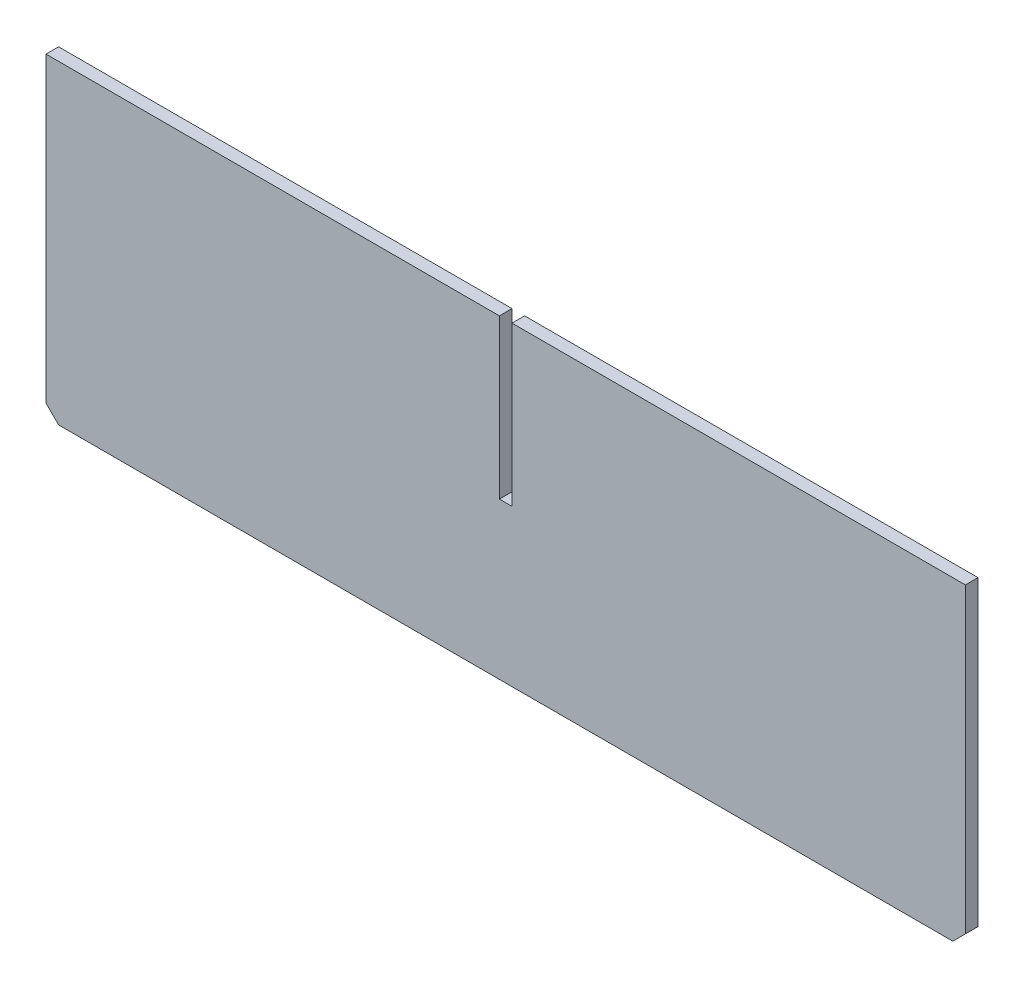
ISO-10303-21;
HEADER;
FILE_DESCRIPTION(('STEP AP214'),'2;1');
FILE_NAME('part.step','',(''),(''),'','','');
FILE_SCHEMA(('AUTOMOTIVE_DESIGN { 1 0 10303 214 1 1 1 1 }'));
ENDSEC;
DATA;
#1=APPLICATION_CONTEXT('core data for automotive mechanical design processes');
#2=APPLICATION_PROTOCOL_DEFINITION('international standard','automotive_design',2000,#1);
#3=PRODUCT_CONTEXT('',#1,'mechanical');
#4=PRODUCT('Part','Part','',(#3));
#5=PRODUCT_RELATED_PRODUCT_CATEGORY('part','',(#4));
#6=PRODUCT_DEFINITION_FORMATION('','',#4);
#7=PRODUCT_DEFINITION_CONTEXT('part definition',#1,'design');
#8=PRODUCT_DEFINITION('design','',#6,#7);
#9=PRODUCT_DEFINITION_SHAPE('','',#8);
#10=(LENGTH_UNIT() NAMED_UNIT(*) SI_UNIT(.MILLI.,.METRE.));
#11=(NAMED_UNIT(*) PLANE_ANGLE_UNIT() SI_UNIT($,.RADIAN.));
#12=(NAMED_UNIT(*) SI_UNIT($,.STERADIAN.) SOLID_ANGLE_UNIT());
#13=UNCERTAINTY_MEASURE_WITH_UNIT(LENGTH_MEASURE(1.E-05),#10,'distance_accuracy_value','');
#14=(GEOMETRIC_REPRESENTATION_CONTEXT(3) GLOBAL_UNCERTAINTY_ASSIGNED_CONTEXT((#13)) GLOBAL_UNIT_ASSIGNED_CONTEXT((#10,
#11,#12)) REPRESENTATION_CONTEXT('',''));
#15=CARTESIAN_POINT('',(0.,0.,0.));
#16=DIRECTION('',(0.,0.,1.));
#17=DIRECTION('',(1.,0.,0.));
#18=AXIS2_PLACEMENT_3D('',#15,#16,#17);
#19=CARTESIAN_POINT('',(0.,0.,2.));
#20=DIRECTION('',(0.,-1.,0.));
#21=DIRECTION('',(0.,0.,-1.));
#22=AXIS2_PLACEMENT_3D('',#19,#20,#21);
#23=PLANE('',#22);
#24=DIRECTION('',(-1.,0.,0.));
#25=VECTOR('',#24,1.);
#26=CARTESIAN_POINT('',(0.,0.,2.));
#27=LINE('',#26,#25);
#28=CARTESIAN_POINT('',(72.,0.,2.));
#29=VERTEX_POINT('',#28);
#30=CARTESIAN_POINT('',(0.,0.,2.));
#31=VERTEX_POINT('',#30);
#32=EDGE_CURVE('E159',#29,#31,#27,.T.);
#33=ORIENTED_EDGE('',*,*,#32,.F.);
#34=DIRECTION('',(0.,0.,1.));
#35=VECTOR('',#34,1.);
#36=CARTESIAN_POINT('',(72.,0.,0.));
#37=LINE('',#36,#35);
#38=CARTESIAN_POINT('',(72.,0.,0.));
#39=VERTEX_POINT('',#38);
#40=EDGE_CURVE('E144',#39,#29,#37,.T.);
#41=ORIENTED_EDGE('',*,*,#40,.F.);
#42=DIRECTION('',(-1.,0.,0.));
#43=VECTOR('',#42,1.);
#44=CARTESIAN_POINT('',(0.,0.,0.));
#45=LINE('',#44,#43);
#46=CARTESIAN_POINT('',(0.,0.,0.));
#47=VERTEX_POINT('',#46);
#48=EDGE_CURVE('E135',#39,#47,#45,.T.);
#49=ORIENTED_EDGE('',*,*,#48,.T.);
#50=DIRECTION('',(0.,0.,-1.));
#51=VECTOR('',#50,1.);
#52=CARTESIAN_POINT('',(0.,0.,2.));
#53=LINE('',#52,#51);
#54=EDGE_CURVE('E163',#31,#47,#53,.T.);
#55=ORIENTED_EDGE('',*,*,#54,.F.);
#56=EDGE_LOOP('',(#33,#41,#49,#55));
#57=FACE_BOUND('',#56,.T.);
#58=ADVANCED_FACE('F37',(#57),#23,.F.);
#59=CARTESIAN_POINT('',(0.,0.,2.));
#60=DIRECTION('',(1.,0.,0.));
#61=DIRECTION('',(0.,1.,0.));
#62=AXIS2_PLACEMENT_3D('',#59,#60,#61);
#63=PLANE('',#62);
#64=DIRECTION('',(0.,-1.,0.));
#65=VECTOR('',#64,1.);
#66=CARTESIAN_POINT('',(0.,0.,0.));
#67=LINE('',#66,#65);
#68=CARTESIAN_POINT('',(0.,-48.,0.));
#69=VERTEX_POINT('',#68);
#70=EDGE_CURVE('E146',#47,#69,#67,.T.);
#71=ORIENTED_EDGE('',*,*,#70,.T.);
#72=DIRECTION('',(0.,0.,1.));
#73=VECTOR('',#72,1.);
#74=CARTESIAN_POINT('',(0.,-48.,2.));
#75=LINE('',#74,#73);
#76=CARTESIAN_POINT('',(0.,-48.,2.));
#77=VERTEX_POINT('',#76);
#78=EDGE_CURVE('E11',#69,#77,#75,.T.);
#79=ORIENTED_EDGE('',*,*,#78,.T.);
#80=DIRECTION('',(0.,-1.,0.));
#81=VECTOR('',#80,1.);
#82=CARTESIAN_POINT('',(0.,0.,2.));
#83=LINE('',#82,#81);
#84=EDGE_CURVE('E151',#31,#77,#83,.T.);
#85=ORIENTED_EDGE('',*,*,#84,.F.);
#86=ORIENTED_EDGE('',*,*,#54,.T.);
#87=EDGE_LOOP('',(#71,#79,#85,#86));
#88=FACE_BOUND('',#87,.T.);
#89=ADVANCED_FACE('F211',(#88),#63,.F.);
#90=CARTESIAN_POINT('',(0.,-50.,2.));
#91=DIRECTION('',(0.,1.,0.));
#92=DIRECTION('',(0.,0.,1.));
#93=AXIS2_PLACEMENT_3D('',#90,#91,#92);
#94=PLANE('',#93);
#95=DIRECTION('',(1.,0.,0.));
#96=VECTOR('',#95,1.);
#97=CARTESIAN_POINT('',(0.,-50.,0.));
#98=LINE('',#97,#96);
#99=CARTESIAN_POINT('',(2.00000000000001,-50.,0.));
#100=VERTEX_POINT('',#99);
#101=CARTESIAN_POINT('',(144.,-50.,0.));
#102=VERTEX_POINT('',#101);
#103=EDGE_CURVE('E165',#100,#102,#98,.T.);
#104=ORIENTED_EDGE('',*,*,#103,.T.);
#105=DIRECTION('',(0.,0.,1.));
#106=VECTOR('',#105,1.);
#107=CARTESIAN_POINT('',(144.,-50.,2.));
#108=LINE('',#107,#106);
#109=CARTESIAN_POINT('',(144.,-50.,2.));
#110=VERTEX_POINT('',#109);
#111=EDGE_CURVE('E187',#102,#110,#108,.T.);
#112=ORIENTED_EDGE('',*,*,#111,.T.);
#113=DIRECTION('',(1.,0.,0.));
#114=VECTOR('',#113,1.);
#115=CARTESIAN_POINT('',(0.,-50.,2.));
#116=LINE('',#115,#114);
#117=CARTESIAN_POINT('',(2.00000000000001,-50.,2.));
#118=VERTEX_POINT('',#117);
#119=EDGE_CURVE('E153',#118,#110,#116,.T.);
#120=ORIENTED_EDGE('',*,*,#119,.F.);
#121=DIRECTION('',(0.,0.,-1.));
#122=VECTOR('',#121,1.);
#123=CARTESIAN_POINT('',(2.00000000000001,-50.,2.));
#124=LINE('',#123,#122);
#125=EDGE_CURVE('E184',#118,#100,#124,.T.);
#126=ORIENTED_EDGE('',*,*,#125,.T.);
#127=EDGE_LOOP('',(#104,#112,#120,#126));
#128=FACE_BOUND('',#127,.T.);
#129=ADVANCED_FACE('F207',(#128),#94,.F.);
#130=CARTESIAN_POINT('',(146.,0.,2.));
#131=DIRECTION('',(-1.,0.,0.));
#132=DIRECTION('',(0.,0.,1.));
#133=AXIS2_PLACEMENT_3D('',#130,#131,#132);
#134=PLANE('',#133);
#135=DIRECTION('',(0.,1.,0.));
#136=VECTOR('',#135,1.);
#137=CARTESIAN_POINT('',(146.,0.,2.));
#138=LINE('',#137,#136);
#139=CARTESIAN_POINT('',(146.,-48.,2.));
#140=VERTEX_POINT('',#139);
#141=CARTESIAN_POINT('',(146.,0.,2.));
#142=VERTEX_POINT('',#141);
#143=EDGE_CURVE('E157',#140,#142,#138,.T.);
#144=ORIENTED_EDGE('',*,*,#143,.F.);
#145=DIRECTION('',(0.,0.,-1.));
#146=VECTOR('',#145,1.);
#147=CARTESIAN_POINT('',(146.,-48.,2.));
#148=LINE('',#147,#146);
#149=CARTESIAN_POINT('',(146.,-48.,0.));
#150=VERTEX_POINT('',#149);
#151=EDGE_CURVE('E177',#140,#150,#148,.T.);
#152=ORIENTED_EDGE('',*,*,#151,.T.);
#153=DIRECTION('',(0.,1.,0.));
#154=VECTOR('',#153,1.);
#155=CARTESIAN_POINT('',(146.,0.,0.));
#156=LINE('',#155,#154);
#157=CARTESIAN_POINT('',(146.,0.,0.));
#158=VERTEX_POINT('',#157);
#159=EDGE_CURVE('E168',#150,#158,#156,.T.);
#160=ORIENTED_EDGE('',*,*,#159,.T.);
#161=DIRECTION('',(0.,0.,-1.));
#162=VECTOR('',#161,1.);
#163=CARTESIAN_POINT('',(146.,0.,2.));
#164=LINE('',#163,#162);
#165=EDGE_CURVE('E174',#142,#158,#164,.T.);
#166=ORIENTED_EDGE('',*,*,#165,.F.);
#167=EDGE_LOOP('',(#144,#152,#160,#166));
#168=FACE_BOUND('',#167,.T.);
#169=ADVANCED_FACE('F200',(#168),#134,.F.);
#170=CARTESIAN_POINT('',(74.,0.,0.));
#171=VERTEX_POINT('',#170);
#172=EDGE_CURVE('E154',#158,#171,#45,.T.);
#173=ORIENTED_EDGE('',*,*,#172,.T.);
#174=DIRECTION('',(0.,0.,1.));
#175=VECTOR('',#174,1.);
#176=CARTESIAN_POINT('',(74.,0.,0.));
#177=LINE('',#176,#175);
#178=CARTESIAN_POINT('',(74.,0.,2.));
#179=VERTEX_POINT('',#178);
#180=EDGE_CURVE('E147',#171,#179,#177,.T.);
#181=ORIENTED_EDGE('',*,*,#180,.T.);
#182=EDGE_CURVE('E160',#142,#179,#27,.T.);
#183=ORIENTED_EDGE('',*,*,#182,.F.);
#184=ORIENTED_EDGE('',*,*,#165,.T.);
#185=EDGE_LOOP('',(#173,#181,#183,#184));
#186=FACE_BOUND('',#185,.T.);
#187=ADVANCED_FACE('F218',(#186),#23,.F.);
#188=CARTESIAN_POINT('',(0.,0.,2.));
#189=DIRECTION('',(0.,0.,1.));
#190=DIRECTION('',(1.,0.,0.));
#191=AXIS2_PLACEMENT_3D('',#188,#189,#190);
#192=PLANE('',#191);
#193=DIRECTION('',(0.,-1.,0.));
#194=VECTOR('',#193,1.);
#195=CARTESIAN_POINT('',(72.,0.,2.));
#196=LINE('',#195,#194);
#197=CARTESIAN_POINT('',(72.,-25.2,2.));
#198=VERTEX_POINT('',#197);
#199=EDGE_CURVE('E121',#29,#198,#196,.T.);
#200=ORIENTED_EDGE('',*,*,#199,.F.);
#201=ORIENTED_EDGE('',*,*,#32,.T.);
#202=ORIENTED_EDGE('',*,*,#84,.T.);
#203=DIRECTION('',(-0.707106781186545,0.70710678118655,0.));
#204=VECTOR('',#203,1.);
#205=CARTESIAN_POINT('',(-24.,-23.9999999999998,2.));
#206=LINE('',#205,#204);
#207=EDGE_CURVE('E189',#77,#118,#206,.F.);
#208=ORIENTED_EDGE('',*,*,#207,.T.);
#209=ORIENTED_EDGE('',*,*,#119,.T.);
#210=DIRECTION('',(-0.70710678118655,-0.707106781186545,0.));
#211=VECTOR('',#210,1.);
#212=CARTESIAN_POINT('',(96.9999999999995,-97.0000000000002,2.));
#213=LINE('',#212,#211);
#214=EDGE_CURVE('E46',#110,#140,#213,.F.);
#215=ORIENTED_EDGE('',*,*,#214,.T.);
#216=ORIENTED_EDGE('',*,*,#143,.T.);
#217=ORIENTED_EDGE('',*,*,#182,.T.);
#218=DIRECTION('',(0.,1.,0.));
#219=VECTOR('',#218,1.);
#220=CARTESIAN_POINT('',(74.,0.,2.));
#221=LINE('',#220,#219);
#222=CARTESIAN_POINT('',(74.,-25.2,2.));
#223=VERTEX_POINT('',#222);
#224=EDGE_CURVE('E136',#223,#179,#221,.T.);
#225=ORIENTED_EDGE('',*,*,#224,.F.);
#226=DIRECTION('',(1.,0.,0.));
#227=VECTOR('',#226,1.);
#228=CARTESIAN_POINT('',(72.,-25.2,2.));
#229=LINE('',#228,#227);
#230=EDGE_CURVE('E138',#198,#223,#229,.T.);
#231=ORIENTED_EDGE('',*,*,#230,.F.);
#232=EDGE_LOOP('',(#200,#201,#202,#208,#209,#215,#216,#217,#225,#231));
#233=FACE_BOUND('',#232,.T.);
#234=ADVANCED_FACE('F193',(#233),#192,.T.);
#235=CARTESIAN_POINT('',(0.,0.,0.));
#236=DIRECTION('',(0.,0.,1.));
#237=DIRECTION('',(1.,0.,0.));
#238=AXIS2_PLACEMENT_3D('',#235,#236,#237);
#239=PLANE('',#238);
#240=ORIENTED_EDGE('',*,*,#48,.F.);
#241=DIRECTION('',(0.,-1.,0.));
#242=VECTOR('',#241,1.);
#243=CARTESIAN_POINT('',(72.,0.,0.));
#244=LINE('',#243,#242);
#245=CARTESIAN_POINT('',(72.,-25.2,0.));
#246=VERTEX_POINT('',#245);
#247=EDGE_CURVE('E118',#39,#246,#244,.T.);
#248=ORIENTED_EDGE('',*,*,#247,.T.);
#249=DIRECTION('',(1.,0.,0.));
#250=VECTOR('',#249,1.);
#251=CARTESIAN_POINT('',(72.,-25.2,0.));
#252=LINE('',#251,#250);
#253=CARTESIAN_POINT('',(74.,-25.2,0.));
#254=VERTEX_POINT('',#253);
#255=EDGE_CURVE('E128',#246,#254,#252,.T.);
#256=ORIENTED_EDGE('',*,*,#255,.T.);
#257=DIRECTION('',(0.,1.,0.));
#258=VECTOR('',#257,1.);
#259=CARTESIAN_POINT('',(74.,0.,0.));
#260=LINE('',#259,#258);
#261=EDGE_CURVE('E53',#254,#171,#260,.T.);
#262=ORIENTED_EDGE('',*,*,#261,.T.);
#263=ORIENTED_EDGE('',*,*,#172,.F.);
#264=ORIENTED_EDGE('',*,*,#159,.F.);
#265=DIRECTION('',(0.70710678118655,0.707106781186545,0.));
#266=VECTOR('',#265,1.);
#267=CARTESIAN_POINT('',(146.,-48.,0.));
#268=LINE('',#267,#266);
#269=EDGE_CURVE('E182',#150,#102,#268,.F.);
#270=ORIENTED_EDGE('',*,*,#269,.T.);
#271=ORIENTED_EDGE('',*,*,#103,.F.);
#272=DIRECTION('',(0.707106781186545,-0.70710678118655,0.));
#273=VECTOR('',#272,1.);
#274=CARTESIAN_POINT('',(2.00000000000001,-50.,0.));
#275=LINE('',#274,#273);
#276=EDGE_CURVE('E180',#100,#69,#275,.F.);
#277=ORIENTED_EDGE('',*,*,#276,.T.);
#278=ORIENTED_EDGE('',*,*,#70,.F.);
#279=EDGE_LOOP('',(#240,#248,#256,#262,#263,#264,#270,#271,#277,#278));
#280=FACE_BOUND('',#279,.T.);
#281=ADVANCED_FACE('F133',(#280),#239,.F.);
#282=CARTESIAN_POINT('',(146.,-48.,2.));
#283=DIRECTION('',(-0.707106781186545,0.70710678118655,0.));
#284=DIRECTION('',(0.,0.,-1.));
#285=AXIS2_PLACEMENT_3D('',#282,#283,#284);
#286=PLANE('',#285);
#287=ORIENTED_EDGE('',*,*,#214,.F.);
#288=ORIENTED_EDGE('',*,*,#111,.F.);
#289=ORIENTED_EDGE('',*,*,#269,.F.);
#290=ORIENTED_EDGE('',*,*,#151,.F.);
#291=EDGE_LOOP('',(#287,#288,#289,#290));
#292=FACE_BOUND('',#291,.T.);
#293=ADVANCED_FACE('F203',(#292),#286,.F.);
#294=CARTESIAN_POINT('',(2.00000000000001,-50.,2.));
#295=DIRECTION('',(0.70710678118655,0.707106781186545,0.));
#296=DIRECTION('',(0.,0.,-1.));
#297=AXIS2_PLACEMENT_3D('',#294,#295,#296);
#298=PLANE('',#297);
#299=ORIENTED_EDGE('',*,*,#207,.F.);
#300=ORIENTED_EDGE('',*,*,#78,.F.);
#301=ORIENTED_EDGE('',*,*,#276,.F.);
#302=ORIENTED_EDGE('',*,*,#125,.F.);
#303=EDGE_LOOP('',(#299,#300,#301,#302));
#304=FACE_BOUND('',#303,.T.);
#305=ADVANCED_FACE('F40',(#304),#298,.F.);
#306=CARTESIAN_POINT('',(72.,0.,0.));
#307=DIRECTION('',(-1.,0.,0.));
#308=DIRECTION('',(0.,-1.,0.));
#309=AXIS2_PLACEMENT_3D('',#306,#307,#308);
#310=PLANE('',#309);
#311=ORIENTED_EDGE('',*,*,#199,.T.);
#312=DIRECTION('',(0.,0.,1.));
#313=VECTOR('',#312,1.);
#314=CARTESIAN_POINT('',(72.,-25.2,0.));
#315=LINE('',#314,#313);
#316=EDGE_CURVE('E114',#246,#198,#315,.T.);
#317=ORIENTED_EDGE('',*,*,#316,.F.);
#318=ORIENTED_EDGE('',*,*,#247,.F.);
#319=ORIENTED_EDGE('',*,*,#40,.T.);
#320=EDGE_LOOP('',(#311,#317,#318,#319));
#321=FACE_BOUND('',#320,.T.);
#322=ADVANCED_FACE('F116',(#321),#310,.F.);
#323=CARTESIAN_POINT('',(74.,0.,0.));
#324=DIRECTION('',(1.,0.,0.));
#325=DIRECTION('',(0.,1.,0.));
#326=AXIS2_PLACEMENT_3D('',#323,#324,#325);
#327=PLANE('',#326);
#328=ORIENTED_EDGE('',*,*,#224,.T.);
#329=ORIENTED_EDGE('',*,*,#180,.F.);
#330=ORIENTED_EDGE('',*,*,#261,.F.);
#331=DIRECTION('',(0.,0.,1.));
#332=VECTOR('',#331,1.);
#333=CARTESIAN_POINT('',(74.,-25.2,0.));
#334=LINE('',#333,#332);
#335=EDGE_CURVE('E125',#254,#223,#334,.T.);
#336=ORIENTED_EDGE('',*,*,#335,.T.);
#337=EDGE_LOOP('',(#328,#329,#330,#336));
#338=FACE_BOUND('',#337,.T.);
#339=ADVANCED_FACE('F216',(#338),#327,.F.);
#340=CARTESIAN_POINT('',(72.,-25.2,0.));
#341=DIRECTION('',(0.,-1.,0.));
#342=DIRECTION('',(0.,0.,-1.));
#343=AXIS2_PLACEMENT_3D('',#340,#341,#342);
#344=PLANE('',#343);
#345=ORIENTED_EDGE('',*,*,#230,.T.);
#346=ORIENTED_EDGE('',*,*,#335,.F.);
#347=ORIENTED_EDGE('',*,*,#255,.F.);
#348=ORIENTED_EDGE('',*,*,#316,.T.);
#349=EDGE_LOOP('',(#345,#346,#347,#348));
#350=FACE_BOUND('',#349,.T.);
#351=ADVANCED_FACE('F129',(#350),#344,.F.);
#352=CLOSED_SHELL('',(#58,#89,#129,#169,#187,#234,#281,#293,#305,#322,#339,#351));
#353=MANIFOLD_SOLID_BREP('B2',#352);
#354=ADVANCED_BREP_SHAPE_REPRESENTATION('',(#18,#353),#14);
#355=SHAPE_DEFINITION_REPRESENTATION(#9,#354);
ENDSEC;
END-ISO-10303-21;
